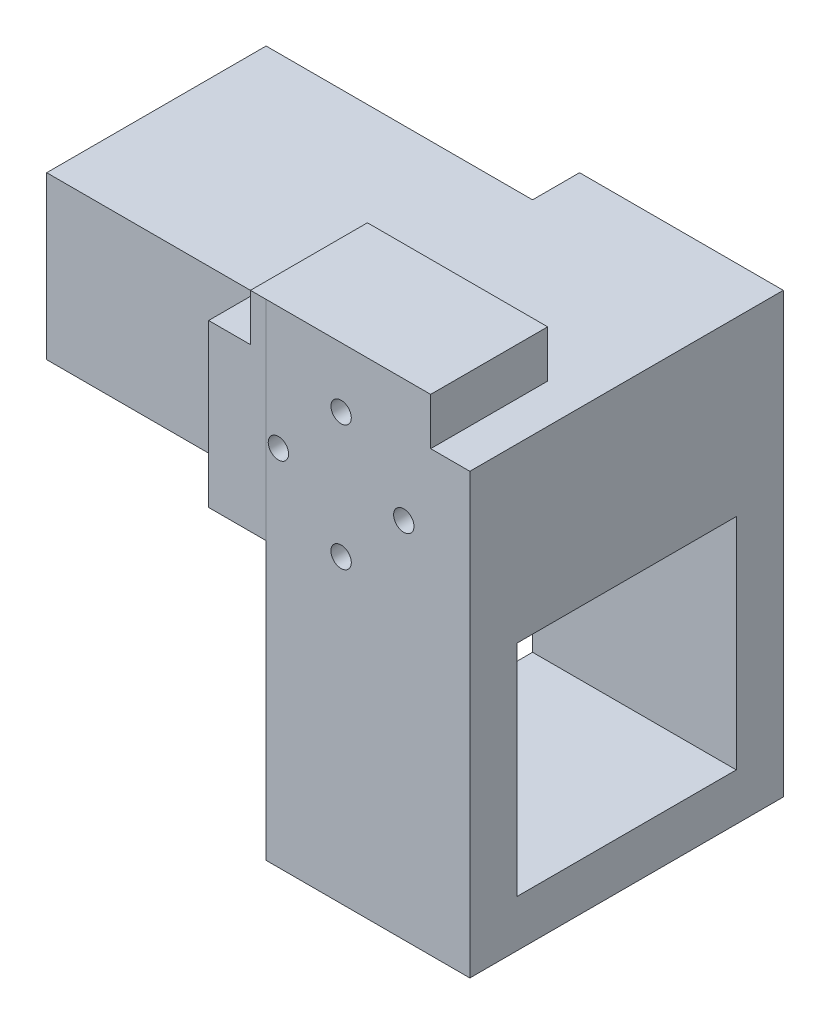
ISO-10303-21;
HEADER;
FILE_DESCRIPTION(('STEP AP214'),'2;1');
FILE_NAME('part.step','',(''),(''),'','','');
FILE_SCHEMA(('AUTOMOTIVE_DESIGN { 1 0 10303 214 1 1 1 1 }'));
ENDSEC;
DATA;
#1=APPLICATION_CONTEXT('core data for automotive mechanical design processes');
#2=APPLICATION_PROTOCOL_DEFINITION('international standard','automotive_design',2000,#1);
#3=PRODUCT_CONTEXT('',#1,'mechanical');
#4=PRODUCT('Part','Part','',(#3));
#5=PRODUCT_RELATED_PRODUCT_CATEGORY('part','',(#4));
#6=PRODUCT_DEFINITION_FORMATION('','',#4);
#7=PRODUCT_DEFINITION_CONTEXT('part definition',#1,'design');
#8=PRODUCT_DEFINITION('design','',#6,#7);
#9=PRODUCT_DEFINITION_SHAPE('','',#8);
#10=(LENGTH_UNIT() NAMED_UNIT(*) SI_UNIT(.MILLI.,.METRE.));
#11=(NAMED_UNIT(*) PLANE_ANGLE_UNIT() SI_UNIT($,.RADIAN.));
#12=(NAMED_UNIT(*) SI_UNIT($,.STERADIAN.) SOLID_ANGLE_UNIT());
#13=UNCERTAINTY_MEASURE_WITH_UNIT(LENGTH_MEASURE(1.E-05),#10,'distance_accuracy_value','');
#14=(GEOMETRIC_REPRESENTATION_CONTEXT(3) GLOBAL_UNCERTAINTY_ASSIGNED_CONTEXT((#13)) GLOBAL_UNIT_ASSIGNED_CONTEXT((#10,
#11,#12)) REPRESENTATION_CONTEXT('',''));
#15=CARTESIAN_POINT('',(0.,0.,0.));
#16=DIRECTION('',(0.,0.,1.));
#17=DIRECTION('',(1.,0.,0.));
#18=AXIS2_PLACEMENT_3D('',#15,#16,#17);
#19=CARTESIAN_POINT('',(-235.389488231933,53.9999999999804,-464.831385650681));
#20=DIRECTION('',(-3.56744395928794E-13,-1.,0.));
#21=DIRECTION('',(-1.,3.56744395928794E-13,5.6399329650958E-13));
#22=AXIS2_PLACEMENT_3D('',#19,#20,#21);
#23=PLANE('',#22);
#24=DIRECTION('',(-5.83825862534767E-13,0.,-1.));
#25=VECTOR('',#24,1.);
#26=CARTESIAN_POINT('',(-242.889488231913,53.9999999999831,-431.831385650679));
#27=LINE('',#26,#25);
#28=CARTESIAN_POINT('',(-242.889488231925,53.9999999999831,-451.831395650692));
#29=VERTEX_POINT('',#28);
#30=CARTESIAN_POINT('',(-242.889488231938,53.9999999999831,-474.223311815104));
#31=VERTEX_POINT('',#30);
#32=EDGE_CURVE('E180',#29,#31,#27,.T.);
#33=ORIENTED_EDGE('',*,*,#32,.F.);
#34=DIRECTION('',(1.,-3.56919355182225E-13,-5.6399329650958E-13));
#35=VECTOR('',#34,1.);
#36=CARTESIAN_POINT('',(-377.617379811657,54.0000000000311,-451.831395650616));
#37=LINE('',#36,#35);
#38=CARTESIAN_POINT('',(-235.389488231926,53.9999999999804,-451.831395650696));
#39=VERTEX_POINT('',#38);
#40=EDGE_CURVE('E220',#29,#39,#37,.T.);
#41=ORIENTED_EDGE('',*,*,#40,.T.);
#42=DIRECTION('',(5.6399329650958E-13,0.,1.));
#43=VECTOR('',#42,1.);
#44=CARTESIAN_POINT('',(-235.389488231933,53.9999999999804,-464.831385650681));
#45=LINE('',#44,#43);
#46=CARTESIAN_POINT('',(-235.389488231959,53.9999999999804,-511.831375650666));
#47=VERTEX_POINT('',#46);
#48=EDGE_CURVE('E321',#47,#39,#45,.T.);
#49=ORIENTED_EDGE('',*,*,#48,.F.);
#50=DIRECTION('',(1.,-3.56919355182225E-13,-5.6399329650958E-13));
#51=VECTOR('',#50,1.);
#52=CARTESIAN_POINT('',(-377.617379811691,54.0000000000311,-511.831375650586));
#53=LINE('',#52,#51);
#54=CARTESIAN_POINT('',(-274.389488231959,54.0000000000311,-511.831375650644));
#55=VERTEX_POINT('',#54);
#56=EDGE_CURVE('E275',#55,#47,#53,.T.);
#57=ORIENTED_EDGE('',*,*,#56,.F.);
#58=DIRECTION('',(-5.6399329650958E-13,0.,-1.));
#59=VECTOR('',#58,1.);
#60=CARTESIAN_POINT('',(-274.389488231959,53.9999999999943,-511.831375650644));
#61=LINE('',#60,#59);
#62=CARTESIAN_POINT('',(-274.389488231954,53.9999999999943,-502.831385650659));
#63=VERTEX_POINT('',#62);
#64=EDGE_CURVE('E241',#63,#55,#61,.T.);
#65=ORIENTED_EDGE('',*,*,#64,.F.);
#66=DIRECTION('',(-1.,3.56744395928794E-13,5.63993296509579E-13));
#67=VECTOR('',#66,1.);
#68=CARTESIAN_POINT('',(-235.389488231954,53.9999999999804,-502.831385650681));
#69=LINE('',#68,#67);
#70=CARTESIAN_POINT('',(-325.389488231954,54.0000000000125,-502.83138565063));
#71=VERTEX_POINT('',#70);
#72=EDGE_CURVE('E324',#63,#71,#69,.T.);
#73=ORIENTED_EDGE('',*,*,#72,.T.);
#74=DIRECTION('',(5.6399329650958E-13,0.,1.));
#75=VECTOR('',#74,1.);
#76=CARTESIAN_POINT('',(-325.389488231933,54.0000000000125,-464.83138565063));
#77=LINE('',#76,#75);
#78=CARTESIAN_POINT('',(-325.38948823193,54.0000000000125,-460.83138565063));
#79=VERTEX_POINT('',#78);
#80=EDGE_CURVE('E325',#71,#79,#77,.T.);
#81=ORIENTED_EDGE('',*,*,#80,.T.);
#82=DIRECTION('',(-1.,3.56744395928794E-13,5.63993296509579E-13));
#83=VECTOR('',#82,1.);
#84=CARTESIAN_POINT('',(-235.389488231931,53.9999999999804,-460.831385650681));
#85=LINE('',#84,#83);
#86=CARTESIAN_POINT('',(-285.389488231931,53.9999999999982,-460.831385650653));
#87=VERTEX_POINT('',#86);
#88=EDGE_CURVE('E11',#87,#79,#85,.T.);
#89=ORIENTED_EDGE('',*,*,#88,.F.);
#90=DIRECTION('',(-5.6399329650958E-13,0.,-1.));
#91=VECTOR('',#90,1.);
#92=CARTESIAN_POINT('',(-285.389488231926,53.9999999999943,-451.831385650653));
#93=LINE('',#92,#91);
#94=CARTESIAN_POINT('',(-285.389488231926,53.9999999999943,-451.831385650653));
#95=VERTEX_POINT('',#94);
#96=EDGE_CURVE('E199',#95,#87,#93,.T.);
#97=ORIENTED_EDGE('',*,*,#96,.F.);
#98=DIRECTION('',(-1.,0.,5.6399329650958E-13));
#99=VECTOR('',#98,1.);
#100=CARTESIAN_POINT('',(-274.389488231925,53.9999999999943,-451.831385650659));
#101=LINE('',#100,#99);
#102=CARTESIAN_POINT('',(-277.389488231926,53.9999999999954,-451.831385650657));
#103=VERTEX_POINT('',#102);
#104=EDGE_CURVE('E194',#103,#95,#101,.T.);
#105=ORIENTED_EDGE('',*,*,#104,.F.);
#106=DIRECTION('',(5.6399329650958E-13,0.,1.));
#107=VECTOR('',#106,1.);
#108=CARTESIAN_POINT('',(-277.389488231914,53.9999999999954,-431.831385650657));
#109=LINE('',#108,#107);
#110=CARTESIAN_POINT('',(-277.389488231938,53.9999999999954,-474.223311815085));
#111=VERTEX_POINT('',#110);
#112=EDGE_CURVE('E59',#111,#103,#109,.T.);
#113=ORIENTED_EDGE('',*,*,#112,.F.);
#114=DIRECTION('',(-1.,3.56762308549607E-13,5.6399329650958E-13));
#115=VECTOR('',#114,1.);
#116=CARTESIAN_POINT('',(-340.889478231938,54.000000000018,-474.223311815049));
#117=LINE('',#116,#115);
#118=EDGE_CURVE('E54',#31,#111,#117,.T.);
#119=ORIENTED_EDGE('',*,*,#118,.F.);
#120=EDGE_LOOP('',(#33,#41,#49,#57,#65,#73,#81,#89,#97,#105,#113,#119));
#121=FACE_BOUND('',#120,.T.);
#122=ADVANCED_FACE('F35',(#121),#23,.F.);
#123=CARTESIAN_POINT('',(-235.38948823194,27.0000199999797,-460.831385650681));
#124=DIRECTION('',(-5.63993296509579E-13,0.,-1.));
#125=DIRECTION('',(-1.,0.,5.6399329650958E-13));
#126=AXIS2_PLACEMENT_3D('',#123,#124,#125);
#127=PLANE('',#126);
#128=DIRECTION('',(0.,-1.,0.));
#129=VECTOR('',#128,1.);
#130=CARTESIAN_POINT('',(-285.389488231931,53.9999999999943,-460.831385650653));
#131=LINE('',#130,#129);
#132=CARTESIAN_POINT('',(-285.389488231931,23.0000199999976,-460.831385650653));
#133=VERTEX_POINT('',#132);
#134=EDGE_CURVE('E183',#87,#133,#131,.T.);
#135=ORIENTED_EDGE('',*,*,#134,.F.);
#136=ORIENTED_EDGE('',*,*,#88,.T.);
#137=DIRECTION('',(-3.56919355182225E-13,-1.,0.));
#138=VECTOR('',#137,1.);
#139=CARTESIAN_POINT('',(-325.38948823194,27.0000200000119,-460.83138565063));
#140=LINE('',#139,#138);
#141=CARTESIAN_POINT('',(-325.389488231942,23.0000200000118,-460.83138565063));
#142=VERTEX_POINT('',#141);
#143=EDGE_CURVE('E318',#79,#142,#140,.T.);
#144=ORIENTED_EDGE('',*,*,#143,.T.);
#145=DIRECTION('',(-1.,3.56744395928794E-13,5.63993296509579E-13));
#146=VECTOR('',#145,1.);
#147=CARTESIAN_POINT('',(-235.389488231942,23.0000199999797,-460.831385650681));
#148=LINE('',#147,#146);
#149=EDGE_CURVE('E46',#133,#142,#148,.T.);
#150=ORIENTED_EDGE('',*,*,#149,.F.);
#151=EDGE_LOOP('',(#135,#136,#144,#150));
#152=FACE_BOUND('',#151,.T.);
#153=ADVANCED_FACE('F37',(#152),#127,.F.);
#154=CARTESIAN_POINT('',(-274.389488231974,-5.70191141326313E-12,-502.831385650659));
#155=DIRECTION('',(1.,-3.56744395928794E-13,-5.63993296509579E-13));
#156=DIRECTION('',(-3.56744395928794E-13,-1.,0.));
#157=AXIS2_PLACEMENT_3D('',#154,#155,#156);
#158=PLANE('',#157);
#159=DIRECTION('',(5.6399329650958E-13,0.,1.));
#160=VECTOR('',#159,1.);
#161=CARTESIAN_POINT('',(-274.389488231981,-21.0000000000057,-502.831385650659));
#162=LINE('',#161,#160);
#163=CARTESIAN_POINT('',(-274.389488231981,-21.0000000000057,-502.831385650659));
#164=VERTEX_POINT('',#163);
#165=CARTESIAN_POINT('',(-274.389488231957,-21.0000000000057,-460.831385650659));
#166=VERTEX_POINT('',#165);
#167=EDGE_CURVE('E278',#164,#166,#162,.T.);
#168=ORIENTED_EDGE('',*,*,#167,.F.);
#169=DIRECTION('',(-3.56744395928794E-13,-1.,0.));
#170=VECTOR('',#169,1.);
#171=CARTESIAN_POINT('',(-274.389488231966,20.9999999999943,-502.831385650659));
#172=LINE('',#171,#170);
#173=CARTESIAN_POINT('',(-274.389488231966,21.0000000000311,-502.831385650659));
#174=VERTEX_POINT('',#173);
#175=EDGE_CURVE('E213',#174,#164,#172,.T.);
#176=ORIENTED_EDGE('',*,*,#175,.F.);
#177=DIRECTION('',(-5.6399329650958E-13,0.,-1.));
#178=VECTOR('',#177,1.);
#179=CARTESIAN_POINT('',(-274.389488231942,20.9999999999943,-460.831385650659));
#180=LINE('',#179,#178);
#181=CARTESIAN_POINT('',(-274.389488231942,20.9999999999943,-460.831385650659));
#182=VERTEX_POINT('',#181);
#183=EDGE_CURVE('E239',#182,#174,#180,.T.);
#184=ORIENTED_EDGE('',*,*,#183,.F.);
#185=DIRECTION('',(3.56744395928794E-13,1.,0.));
#186=VECTOR('',#185,1.);
#187=CARTESIAN_POINT('',(-274.389488231957,-21.0000000000057,-460.831385650659));
#188=LINE('',#187,#186);
#189=EDGE_CURVE('E233',#166,#182,#188,.T.);
#190=ORIENTED_EDGE('',*,*,#189,.F.);
#191=EDGE_LOOP('',(#168,#176,#184,#190));
#192=FACE_BOUND('',#191,.T.);
#193=DIRECTION('',(3.56744395928794E-13,1.,0.));
#194=VECTOR('',#193,1.);
#195=CARTESIAN_POINT('',(-274.389488231925,53.9999999999943,-451.831395650674));
#196=LINE('',#195,#194);
#197=CARTESIAN_POINT('',(-274.389488231955,-30.0000000000196,-451.831395650674));
#198=VERTEX_POINT('',#197);
#199=CARTESIAN_POINT('',(-274.389488231925,23.0000199999936,-451.831390650667));
#200=VERTEX_POINT('',#199);
#201=EDGE_CURVE('E339',#198,#200,#196,.T.);
#202=ORIENTED_EDGE('',*,*,#201,.T.);
#203=DIRECTION('',(-5.6399329650958E-13,0.,-1.));
#204=VECTOR('',#203,1.);
#205=CARTESIAN_POINT('',(-274.389488231942,23.0000199999936,-460.831385650659));
#206=LINE('',#205,#204);
#207=CARTESIAN_POINT('',(-274.389488231965,23.0000199999797,-502.831385650659));
#208=VERTEX_POINT('',#207);
#209=EDGE_CURVE('E232',#200,#208,#206,.T.);
#210=ORIENTED_EDGE('',*,*,#209,.T.);
#211=DIRECTION('',(3.56744395928794E-13,1.,0.));
#212=VECTOR('',#211,1.);
#213=CARTESIAN_POINT('',(-274.389488231965,23.0000199999937,-502.831385650659));
#214=LINE('',#213,#212);
#215=EDGE_CURVE('E234',#208,#63,#214,.T.);
#216=ORIENTED_EDGE('',*,*,#215,.T.);
#217=ORIENTED_EDGE('',*,*,#64,.T.);
#218=DIRECTION('',(-3.56744395928794E-13,-1.,0.));
#219=VECTOR('',#218,1.);
#220=CARTESIAN_POINT('',(-274.389488231989,-30.0000000000057,-511.831375650644));
#221=LINE('',#220,#219);
#222=CARTESIAN_POINT('',(-274.389488231989,-30.0000000000057,-511.831375650644));
#223=VERTEX_POINT('',#222);
#224=EDGE_CURVE('E244',#55,#223,#221,.T.);
#225=ORIENTED_EDGE('',*,*,#224,.T.);
#226=DIRECTION('',(5.6399329650958E-13,0.,1.));
#227=VECTOR('',#226,1.);
#228=CARTESIAN_POINT('',(-274.389488231955,-30.0000000000057,-451.831395650674));
#229=LINE('',#228,#227);
#230=EDGE_CURVE('E340',#223,#198,#229,.T.);
#231=ORIENTED_EDGE('',*,*,#230,.T.);
#232=EDGE_LOOP('',(#202,#210,#216,#217,#225,#231));
#233=FACE_BOUND('',#232,.T.);
#234=ADVANCED_FACE('F346',(#192,#233),#158,.F.);
#235=CARTESIAN_POINT('',(-235.389488231963,23.0000199999797,-498.831385650681));
#236=DIRECTION('',(3.56744395928794E-13,1.,0.));
#237=DIRECTION('',(1.,-3.56744395928794E-13,-5.6399329650958E-13));
#238=AXIS2_PLACEMENT_3D('',#235,#236,#237);
#239=PLANE('',#238);
#240=ORIENTED_EDGE('',*,*,#209,.F.);
#241=DIRECTION('',(1.,0.,-5.6399329650958E-13));
#242=VECTOR('',#241,1.);
#243=CARTESIAN_POINT('',(-274.389488231925,23.0000199999936,-451.831385650659));
#244=LINE('',#243,#242);
#245=CARTESIAN_POINT('',(-285.389488231926,23.0000199999936,-451.831385650653));
#246=VERTEX_POINT('',#245);
#247=EDGE_CURVE('E193',#246,#200,#244,.T.);
#248=ORIENTED_EDGE('',*,*,#247,.F.);
#249=DIRECTION('',(-5.6399329650958E-13,0.,-1.));
#250=VECTOR('',#249,1.);
#251=CARTESIAN_POINT('',(-285.389488231926,23.0000199999936,-451.831385650653));
#252=LINE('',#251,#250);
#253=EDGE_CURVE('E196',#246,#133,#252,.T.);
#254=ORIENTED_EDGE('',*,*,#253,.T.);
#255=ORIENTED_EDGE('',*,*,#149,.T.);
#256=DIRECTION('',(-5.6399329650958E-13,0.,-1.));
#257=VECTOR('',#256,1.);
#258=CARTESIAN_POINT('',(-325.389488231963,23.0000200000118,-498.83138565063));
#259=LINE('',#258,#257);
#260=CARTESIAN_POINT('',(-325.389488231965,23.0000200000118,-502.83138565063));
#261=VERTEX_POINT('',#260);
#262=EDGE_CURVE('E328',#142,#261,#259,.T.);
#263=ORIENTED_EDGE('',*,*,#262,.T.);
#264=DIRECTION('',(-1.,3.56744395928794E-13,5.63993296509579E-13));
#265=VECTOR('',#264,1.);
#266=CARTESIAN_POINT('',(-235.389488231965,23.0000199999797,-502.831385650681));
#267=LINE('',#266,#265);
#268=EDGE_CURVE('E337',#208,#261,#267,.T.);
#269=ORIENTED_EDGE('',*,*,#268,.F.);
#270=EDGE_LOOP('',(#240,#248,#254,#255,#263,#269));
#271=FACE_BOUND('',#270,.T.);
#272=ADVANCED_FACE('F404',(#271),#239,.F.);
#273=CARTESIAN_POINT('',(-235.389488231954,53.9999999999804,-502.831385650681));
#274=DIRECTION('',(5.63993296509579E-13,0.,1.));
#275=DIRECTION('',(1.,0.,-5.6399329650958E-13));
#276=AXIS2_PLACEMENT_3D('',#273,#274,#275);
#277=PLANE('',#276);
#278=ORIENTED_EDGE('',*,*,#215,.F.);
#279=ORIENTED_EDGE('',*,*,#268,.T.);
#280=DIRECTION('',(3.56919355182225E-13,1.,0.));
#281=VECTOR('',#280,1.);
#282=CARTESIAN_POINT('',(-325.389488231954,54.0000000000125,-502.83138565063));
#283=LINE('',#282,#281);
#284=EDGE_CURVE('E331',#261,#71,#283,.T.);
#285=ORIENTED_EDGE('',*,*,#284,.T.);
#286=ORIENTED_EDGE('',*,*,#72,.F.);
#287=EDGE_LOOP('',(#278,#279,#285,#286));
#288=FACE_BOUND('',#287,.T.);
#289=ADVANCED_FACE('F402',(#288),#277,.F.);
#290=CARTESIAN_POINT('',(-235.389488231934,-3.76392420697224E-11,-431.831385650681));
#291=DIRECTION('',(1.,-3.56919355182225E-13,-5.6399329650958E-13));
#292=DIRECTION('',(-3.56919355182225E-13,-1.,0.));
#293=AXIS2_PLACEMENT_3D('',#290,#291,#292);
#294=PLANE('',#293);
#295=DIRECTION('',(3.57022612531989E-13,1.,0.));
#296=VECTOR('',#295,1.);
#297=CARTESIAN_POINT('',(-235.389488231989,-30.0000000000196,-511.831375650666));
#298=LINE('',#297,#296);
#299=CARTESIAN_POINT('',(-235.389488231989,-30.0000000000196,-511.831375650666));
#300=VERTEX_POINT('',#299);
#301=EDGE_CURVE('E224',#300,#47,#298,.T.);
#302=ORIENTED_EDGE('',*,*,#301,.T.);
#303=ORIENTED_EDGE('',*,*,#48,.T.);
#304=DIRECTION('',(-3.57022612531989E-13,-1.,0.));
#305=VECTOR('',#304,1.);
#306=CARTESIAN_POINT('',(-235.389488231926,53.9999999999804,-451.831395650696));
#307=LINE('',#306,#305);
#308=CARTESIAN_POINT('',(-235.389488231955,-30.0000000000196,-451.831395650696));
#309=VERTEX_POINT('',#308);
#310=EDGE_CURVE('E262',#39,#309,#307,.T.);
#311=ORIENTED_EDGE('',*,*,#310,.T.);
#312=DIRECTION('',(-5.63993296509579E-13,0.,-1.));
#313=VECTOR('',#312,1.);
#314=CARTESIAN_POINT('',(-235.389488231955,-30.0000000000196,-451.831395650696));
#315=LINE('',#314,#313);
#316=EDGE_CURVE('E270',#309,#300,#315,.T.);
#317=ORIENTED_EDGE('',*,*,#316,.T.);
#318=EDGE_LOOP('',(#302,#303,#311,#317));
#319=FACE_BOUND('',#318,.T.);
#320=DIRECTION('',(-3.56857400772372E-13,-1.,0.));
#321=VECTOR('',#320,1.);
#322=CARTESIAN_POINT('',(-235.389488231957,-21.0000000000196,-460.831385650681));
#323=LINE('',#322,#321);
#324=CARTESIAN_POINT('',(-235.389488231942,20.9999999999804,-460.831385650681));
#325=VERTEX_POINT('',#324);
#326=CARTESIAN_POINT('',(-235.389488231957,-21.0000000000196,-460.831385650681));
#327=VERTEX_POINT('',#326);
#328=EDGE_CURVE('E202',#325,#327,#323,.T.);
#329=ORIENTED_EDGE('',*,*,#328,.F.);
#330=DIRECTION('',(5.6399329650958E-13,0.,1.));
#331=VECTOR('',#330,1.);
#332=CARTESIAN_POINT('',(-235.389488231942,20.9999999999804,-460.831385650681));
#333=LINE('',#332,#331);
#334=CARTESIAN_POINT('',(-235.389488231966,20.9999999999804,-502.831385650681));
#335=VERTEX_POINT('',#334);
#336=EDGE_CURVE('E256',#335,#325,#333,.T.);
#337=ORIENTED_EDGE('',*,*,#336,.F.);
#338=DIRECTION('',(3.56857400772372E-13,1.,0.));
#339=VECTOR('',#338,1.);
#340=CARTESIAN_POINT('',(-235.389488231966,20.9999999999804,-502.831385650681));
#341=LINE('',#340,#339);
#342=CARTESIAN_POINT('',(-235.389488231981,-21.0000000000196,-502.831385650681));
#343=VERTEX_POINT('',#342);
#344=EDGE_CURVE('E253',#343,#335,#341,.T.);
#345=ORIENTED_EDGE('',*,*,#344,.F.);
#346=DIRECTION('',(-5.6399329650958E-13,0.,-1.));
#347=VECTOR('',#346,1.);
#348=CARTESIAN_POINT('',(-235.389488231981,-21.0000000000196,-502.831385650681));
#349=LINE('',#348,#347);
#350=EDGE_CURVE('E250',#327,#343,#349,.T.);
#351=ORIENTED_EDGE('',*,*,#350,.F.);
#352=EDGE_LOOP('',(#329,#337,#345,#351));
#353=FACE_BOUND('',#352,.T.);
#354=ADVANCED_FACE('F358',(#319,#353),#294,.T.);
#355=CARTESIAN_POINT('',(-325.389488231934,-5.53224643613094E-12,-431.83138565063));
#356=DIRECTION('',(1.,-3.56919355182225E-13,-5.6399329650958E-13));
#357=DIRECTION('',(-3.56919355182225E-13,-1.,0.));
#358=AXIS2_PLACEMENT_3D('',#355,#356,#357);
#359=PLANE('',#358);
#360=CARTESIAN_POINT('',(-325.389488231952,46.0000100000125,-494.33138565063));
#361=DIRECTION('',(-1.,3.56919355182225E-13,5.6399329650958E-13));
#362=DIRECTION('',(3.56919355182225E-13,1.,0.));
#363=AXIS2_PLACEMENT_3D('',#360,#361,#362);
#364=CIRCLE('',#363,2.55);
#365=CARTESIAN_POINT('',(-325.389488231951,48.5500100000125,-494.33138565063));
#366=VERTEX_POINT('',#365);
#367=EDGE_CURVE('E312',#366,#366,#364,.T.);
#368=ORIENTED_EDGE('',*,*,#367,.F.);
#369=EDGE_LOOP('',(#368));
#370=FACE_BOUND('',#369,.T.);
#371=CARTESIAN_POINT('',(-325.389488231945,46.0000100000125,-481.83138565063));
#372=DIRECTION('',(-1.,3.56919355182225E-13,5.6399329650958E-13));
#373=DIRECTION('',(3.56919355182225E-13,1.,0.));
#374=AXIS2_PLACEMENT_3D('',#371,#372,#373);
#375=CIRCLE('',#374,2.55);
#376=CARTESIAN_POINT('',(-325.389488231944,48.5500100000125,-481.83138565063));
#377=VERTEX_POINT('',#376);
#378=EDGE_CURVE('E306',#377,#377,#375,.T.);
#379=ORIENTED_EDGE('',*,*,#378,.F.);
#380=EDGE_LOOP('',(#379));
#381=FACE_BOUND('',#380,.T.);
#382=CARTESIAN_POINT('',(-325.389488231938,46.0000100000125,-469.33138565063));
#383=DIRECTION('',(-1.,3.56919355182225E-13,5.6399329650958E-13));
#384=DIRECTION('',(3.56919355182225E-13,1.,0.));
#385=AXIS2_PLACEMENT_3D('',#382,#383,#384);
#386=CIRCLE('',#385,2.55);
#387=CARTESIAN_POINT('',(-325.389488231937,48.5500100000125,-469.33138565063));
#388=VERTEX_POINT('',#387);
#389=EDGE_CURVE('E300',#388,#388,#386,.T.);
#390=ORIENTED_EDGE('',*,*,#389,.F.);
#391=EDGE_LOOP('',(#390));
#392=FACE_BOUND('',#391,.T.);
#393=CARTESIAN_POINT('',(-325.389488231944,31.0000100000125,-469.33138565063));
#394=DIRECTION('',(-1.,3.56919355182225E-13,5.6399329650958E-13));
#395=DIRECTION('',(3.56919355182225E-13,1.,0.));
#396=AXIS2_PLACEMENT_3D('',#393,#394,#395);
#397=CIRCLE('',#396,2.55);
#398=CARTESIAN_POINT('',(-325.389488231943,33.5500100000125,-469.33138565063));
#399=VERTEX_POINT('',#398);
#400=EDGE_CURVE('E294',#399,#399,#397,.T.);
#401=ORIENTED_EDGE('',*,*,#400,.F.);
#402=EDGE_LOOP('',(#401));
#403=FACE_BOUND('',#402,.T.);
#404=CARTESIAN_POINT('',(-325.389488231951,31.0000100000125,-481.83138565063));
#405=DIRECTION('',(-1.,3.56919355182225E-13,5.6399329650958E-13));
#406=DIRECTION('',(3.56919355182225E-13,1.,0.));
#407=AXIS2_PLACEMENT_3D('',#404,#405,#406);
#408=CIRCLE('',#407,2.55);
#409=CARTESIAN_POINT('',(-325.38948823195,33.5500100000125,-481.83138565063));
#410=VERTEX_POINT('',#409);
#411=EDGE_CURVE('E288',#410,#410,#408,.T.);
#412=ORIENTED_EDGE('',*,*,#411,.F.);
#413=EDGE_LOOP('',(#412));
#414=FACE_BOUND('',#413,.T.);
#415=CARTESIAN_POINT('',(-325.389488231958,31.0000100000125,-494.33138565063));
#416=DIRECTION('',(-1.,3.56919355182225E-13,5.6399329650958E-13));
#417=DIRECTION('',(3.56919355182225E-13,1.,0.));
#418=AXIS2_PLACEMENT_3D('',#415,#416,#417);
#419=CIRCLE('',#418,2.55);
#420=CARTESIAN_POINT('',(-325.389488231957,33.5500100000125,-494.33138565063));
#421=VERTEX_POINT('',#420);
#422=EDGE_CURVE('E287',#421,#421,#419,.T.);
#423=ORIENTED_EDGE('',*,*,#422,.F.);
#424=EDGE_LOOP('',(#423));
#425=FACE_BOUND('',#424,.T.);
#426=ORIENTED_EDGE('',*,*,#143,.F.);
#427=ORIENTED_EDGE('',*,*,#80,.F.);
#428=ORIENTED_EDGE('',*,*,#284,.F.);
#429=ORIENTED_EDGE('',*,*,#262,.F.);
#430=EDGE_LOOP('',(#426,#427,#428,#429));
#431=FACE_BOUND('',#430,.T.);
#432=ADVANCED_FACE('F400',(#370,#381,#392,#403,#414,#425,#431),#359,.F.);
#433=CARTESIAN_POINT('',(-310.389488231958,31.0000100000071,-494.331385650639));
#434=DIRECTION('',(-1.,3.56919355182225E-13,5.6399329650958E-13));
#435=DIRECTION('',(3.56919355182225E-13,1.,0.));
#436=AXIS2_PLACEMENT_3D('',#433,#434,#435);
#437=CYLINDRICAL_SURFACE('',#436,2.55);
#438=CARTESIAN_POINT('',(-310.389488231958,31.0000100000071,-494.331385650639));
#439=DIRECTION('',(-1.,3.56919355182225E-13,5.6399329650958E-13));
#440=DIRECTION('',(3.56919355182225E-13,1.,0.));
#441=AXIS2_PLACEMENT_3D('',#438,#439,#440);
#442=CIRCLE('',#441,2.55);
#443=CARTESIAN_POINT('',(-310.389488231957,33.5500100000071,-494.331385650639));
#444=VERTEX_POINT('',#443);
#445=EDGE_CURVE('E315',#444,#444,#442,.T.);
#446=ORIENTED_EDGE('',*,*,#445,.F.);
#447=EDGE_LOOP('',(#446));
#448=FACE_BOUND('',#447,.T.);
#449=ORIENTED_EDGE('',*,*,#422,.T.);
#450=EDGE_LOOP('',(#449));
#451=FACE_BOUND('',#450,.T.);
#452=ADVANCED_FACE('F528',(#448,#451),#437,.F.);
#453=CARTESIAN_POINT('',(-310.389488231958,31.0000100000071,-494.331385650639));
#454=DIRECTION('',(-1.,3.56919355182225E-13,5.6399329650958E-13));
#455=DIRECTION('',(3.56919355182225E-13,1.,0.));
#456=AXIS2_PLACEMENT_3D('',#453,#454,#455);
#457=PLANE('',#456);
#458=ORIENTED_EDGE('',*,*,#445,.T.);
#459=EDGE_LOOP('',(#458));
#460=FACE_BOUND('',#459,.T.);
#461=ADVANCED_FACE('F498',(#460),#457,.T.);
#462=CARTESIAN_POINT('',(-310.389488231951,31.0000100000071,-481.831385650639));
#463=DIRECTION('',(-1.,3.56919355182225E-13,5.6399329650958E-13));
#464=DIRECTION('',(3.56919355182225E-13,1.,0.));
#465=AXIS2_PLACEMENT_3D('',#462,#463,#464);
#466=CYLINDRICAL_SURFACE('',#465,2.55);
#467=CARTESIAN_POINT('',(-310.389488231951,31.0000100000071,-481.831385650639));
#468=DIRECTION('',(-1.,3.56919355182225E-13,5.6399329650958E-13));
#469=DIRECTION('',(3.56919355182225E-13,1.,0.));
#470=AXIS2_PLACEMENT_3D('',#467,#468,#469);
#471=CIRCLE('',#470,2.55);
#472=CARTESIAN_POINT('',(-310.38948823195,33.5500100000071,-481.831385650639));
#473=VERTEX_POINT('',#472);
#474=EDGE_CURVE('E284',#473,#473,#471,.T.);
#475=ORIENTED_EDGE('',*,*,#474,.F.);
#476=EDGE_LOOP('',(#475));
#477=FACE_BOUND('',#476,.T.);
#478=ORIENTED_EDGE('',*,*,#411,.T.);
#479=EDGE_LOOP('',(#478));
#480=FACE_BOUND('',#479,.T.);
#481=ADVANCED_FACE('F494',(#477,#480),#466,.F.);
#482=CARTESIAN_POINT('',(-310.389488231951,31.0000100000071,-481.831385650639));
#483=DIRECTION('',(-1.,3.56919355182225E-13,5.6399329650958E-13));
#484=DIRECTION('',(3.56919355182225E-13,1.,0.));
#485=AXIS2_PLACEMENT_3D('',#482,#483,#484);
#486=PLANE('',#485);
#487=ORIENTED_EDGE('',*,*,#474,.T.);
#488=EDGE_LOOP('',(#487));
#489=FACE_BOUND('',#488,.T.);
#490=ADVANCED_FACE('F483',(#489),#486,.T.);
#491=CARTESIAN_POINT('',(-310.389488231944,31.0000100000071,-469.331385650639));
#492=DIRECTION('',(-1.,3.56919355182225E-13,5.6399329650958E-13));
#493=DIRECTION('',(3.56919355182225E-13,1.,0.));
#494=AXIS2_PLACEMENT_3D('',#491,#492,#493);
#495=CYLINDRICAL_SURFACE('',#494,2.55);
#496=CARTESIAN_POINT('',(-310.389488231944,31.0000100000071,-469.331385650639));
#497=DIRECTION('',(-1.,3.56919355182225E-13,5.6399329650958E-13));
#498=DIRECTION('',(3.56919355182225E-13,1.,0.));
#499=AXIS2_PLACEMENT_3D('',#496,#497,#498);
#500=CIRCLE('',#499,2.55);
#501=CARTESIAN_POINT('',(-310.389488231943,33.5500100000071,-469.331385650639));
#502=VERTEX_POINT('',#501);
#503=EDGE_CURVE('E291',#502,#502,#500,.T.);
#504=ORIENTED_EDGE('',*,*,#503,.F.);
#505=EDGE_LOOP('',(#504));
#506=FACE_BOUND('',#505,.T.);
#507=ORIENTED_EDGE('',*,*,#400,.T.);
#508=EDGE_LOOP('',(#507));
#509=FACE_BOUND('',#508,.T.);
#510=ADVANCED_FACE('F493',(#506,#509),#495,.F.);
#511=CARTESIAN_POINT('',(-310.389488231944,31.0000100000071,-469.331385650639));
#512=DIRECTION('',(-1.,3.56919355182225E-13,5.6399329650958E-13));
#513=DIRECTION('',(3.56919355182225E-13,1.,0.));
#514=AXIS2_PLACEMENT_3D('',#511,#512,#513);
#515=PLANE('',#514);
#516=ORIENTED_EDGE('',*,*,#503,.T.);
#517=EDGE_LOOP('',(#516));
#518=FACE_BOUND('',#517,.T.);
#519=ADVANCED_FACE('F500',(#518),#515,.T.);
#520=CARTESIAN_POINT('',(-310.389488231938,46.0000100000071,-469.331385650639));
#521=DIRECTION('',(-1.,3.56919355182225E-13,5.6399329650958E-13));
#522=DIRECTION('',(3.56919355182225E-13,1.,0.));
#523=AXIS2_PLACEMENT_3D('',#520,#521,#522);
#524=CYLINDRICAL_SURFACE('',#523,2.55);
#525=CARTESIAN_POINT('',(-310.389488231938,46.0000100000071,-469.331385650639));
#526=DIRECTION('',(-1.,3.56919355182225E-13,5.6399329650958E-13));
#527=DIRECTION('',(3.56919355182225E-13,1.,0.));
#528=AXIS2_PLACEMENT_3D('',#525,#526,#527);
#529=CIRCLE('',#528,2.55);
#530=CARTESIAN_POINT('',(-310.389488231937,48.5500100000071,-469.331385650639));
#531=VERTEX_POINT('',#530);
#532=EDGE_CURVE('E297',#531,#531,#529,.T.);
#533=ORIENTED_EDGE('',*,*,#532,.F.);
#534=EDGE_LOOP('',(#533));
#535=FACE_BOUND('',#534,.T.);
#536=ORIENTED_EDGE('',*,*,#389,.T.);
#537=EDGE_LOOP('',(#536));
#538=FACE_BOUND('',#537,.T.);
#539=ADVANCED_FACE('F503',(#535,#538),#524,.F.);
#540=CARTESIAN_POINT('',(-310.389488231938,46.0000100000071,-469.331385650639));
#541=DIRECTION('',(-1.,3.56919355182225E-13,5.6399329650958E-13));
#542=DIRECTION('',(3.56919355182225E-13,1.,0.));
#543=AXIS2_PLACEMENT_3D('',#540,#541,#542);
#544=PLANE('',#543);
#545=ORIENTED_EDGE('',*,*,#532,.T.);
#546=EDGE_LOOP('',(#545));
#547=FACE_BOUND('',#546,.T.);
#548=ADVANCED_FACE('F508',(#547),#544,.T.);
#549=CARTESIAN_POINT('',(-310.389488231945,46.0000100000071,-481.831385650639));
#550=DIRECTION('',(-1.,3.56919355182225E-13,5.6399329650958E-13));
#551=DIRECTION('',(3.56919355182225E-13,1.,0.));
#552=AXIS2_PLACEMENT_3D('',#549,#550,#551);
#553=CYLINDRICAL_SURFACE('',#552,2.55);
#554=CARTESIAN_POINT('',(-310.389488231945,46.0000100000071,-481.831385650639));
#555=DIRECTION('',(-1.,3.56919355182225E-13,5.6399329650958E-13));
#556=DIRECTION('',(3.56919355182225E-13,1.,0.));
#557=AXIS2_PLACEMENT_3D('',#554,#555,#556);
#558=CIRCLE('',#557,2.55);
#559=CARTESIAN_POINT('',(-310.389488231944,48.5500100000071,-481.831385650639));
#560=VERTEX_POINT('',#559);
#561=EDGE_CURVE('E303',#560,#560,#558,.T.);
#562=ORIENTED_EDGE('',*,*,#561,.F.);
#563=EDGE_LOOP('',(#562));
#564=FACE_BOUND('',#563,.T.);
#565=ORIENTED_EDGE('',*,*,#378,.T.);
#566=EDGE_LOOP('',(#565));
#567=FACE_BOUND('',#566,.T.);
#568=ADVANCED_FACE('F511',(#564,#567),#553,.F.);
#569=CARTESIAN_POINT('',(-310.389488231945,46.0000100000071,-481.831385650639));
#570=DIRECTION('',(-1.,3.56919355182225E-13,5.6399329650958E-13));
#571=DIRECTION('',(3.56919355182225E-13,1.,0.));
#572=AXIS2_PLACEMENT_3D('',#569,#570,#571);
#573=PLANE('',#572);
#574=ORIENTED_EDGE('',*,*,#561,.T.);
#575=EDGE_LOOP('',(#574));
#576=FACE_BOUND('',#575,.T.);
#577=ADVANCED_FACE('F516',(#576),#573,.T.);
#578=CARTESIAN_POINT('',(-310.389488231952,46.0000100000071,-494.331385650639));
#579=DIRECTION('',(-1.,3.56919355182225E-13,5.6399329650958E-13));
#580=DIRECTION('',(3.56919355182225E-13,1.,0.));
#581=AXIS2_PLACEMENT_3D('',#578,#579,#580);
#582=CYLINDRICAL_SURFACE('',#581,2.55);
#583=CARTESIAN_POINT('',(-310.389488231952,46.0000100000071,-494.331385650639));
#584=DIRECTION('',(-1.,3.56919355182225E-13,5.6399329650958E-13));
#585=DIRECTION('',(3.56919355182225E-13,1.,0.));
#586=AXIS2_PLACEMENT_3D('',#583,#584,#585);
#587=CIRCLE('',#586,2.55);
#588=CARTESIAN_POINT('',(-310.389488231951,48.5500100000071,-494.331385650639));
#589=VERTEX_POINT('',#588);
#590=EDGE_CURVE('E309',#589,#589,#587,.T.);
#591=ORIENTED_EDGE('',*,*,#590,.F.);
#592=EDGE_LOOP('',(#591));
#593=FACE_BOUND('',#592,.T.);
#594=ORIENTED_EDGE('',*,*,#367,.T.);
#595=EDGE_LOOP('',(#594));
#596=FACE_BOUND('',#595,.T.);
#597=ADVANCED_FACE('F475',(#593,#596),#582,.F.);
#598=CARTESIAN_POINT('',(-310.389488231952,46.0000100000071,-494.331385650639));
#599=DIRECTION('',(-1.,3.56919355182225E-13,5.6399329650958E-13));
#600=DIRECTION('',(3.56919355182225E-13,1.,0.));
#601=AXIS2_PLACEMENT_3D('',#598,#599,#600);
#602=PLANE('',#601);
#603=ORIENTED_EDGE('',*,*,#590,.T.);
#604=EDGE_LOOP('',(#603));
#605=FACE_BOUND('',#604,.T.);
#606=ADVANCED_FACE('F467',(#605),#602,.T.);
#607=CARTESIAN_POINT('',(-377.617379811657,54.0000000000311,-451.831395650616));
#608=DIRECTION('',(5.6399329650958E-13,0.,1.));
#609=DIRECTION('',(0.,1.,0.));
#610=AXIS2_PLACEMENT_3D('',#607,#608,#609);
#611=PLANE('',#610);
#612=CARTESIAN_POINT('',(-260.034313650955,51.5101937964349,-451.831395650682));
#613=DIRECTION('',(5.6399329650958E-13,0.,1.));
#614=DIRECTION('',(0.,1.,0.));
#615=AXIS2_PLACEMENT_3D('',#612,#613,#614);
#616=CIRCLE('',#615,1.95000000001596);
#617=CARTESIAN_POINT('',(-260.034313650955,53.4601937964509,-451.831395650682));
#618=VERTEX_POINT('',#617);
#619=EDGE_CURVE('E438',#618,#618,#616,.T.);
#620=ORIENTED_EDGE('',*,*,#619,.F.);
#621=EDGE_LOOP('',(#620));
#622=FACE_BOUND('',#621,.T.);
#623=CARTESIAN_POINT('',(-248.034313650954,39.5101937964351,-451.831395650689));
#624=DIRECTION('',(5.6399329650958E-13,0.,1.));
#625=DIRECTION('',(0.,1.,0.));
#626=AXIS2_PLACEMENT_3D('',#623,#624,#625);
#627=CIRCLE('',#626,1.95000000001596);
#628=CARTESIAN_POINT('',(-248.034313650954,41.460193796451,-451.831395650689));
#629=VERTEX_POINT('',#628);
#630=EDGE_CURVE('E448',#629,#629,#627,.T.);
#631=ORIENTED_EDGE('',*,*,#630,.F.);
#632=EDGE_LOOP('',(#631));
#633=FACE_BOUND('',#632,.T.);
#634=CARTESIAN_POINT('',(-260.034313650954,27.5101937964349,-451.831395650682));
#635=DIRECTION('',(5.6399329650958E-13,0.,1.));
#636=DIRECTION('',(0.,1.,0.));
#637=AXIS2_PLACEMENT_3D('',#634,#635,#636);
#638=CIRCLE('',#637,1.95000000001596);
#639=CARTESIAN_POINT('',(-260.034313650954,29.4601937964509,-451.831395650682));
#640=VERTEX_POINT('',#639);
#641=EDGE_CURVE('E454',#640,#640,#638,.T.);
#642=ORIENTED_EDGE('',*,*,#641,.F.);
#643=EDGE_LOOP('',(#642));
#644=FACE_BOUND('',#643,.T.);
#645=CARTESIAN_POINT('',(-272.034313650954,39.5101937964349,-451.831395650676));
#646=DIRECTION('',(5.6399329650958E-13,0.,1.));
#647=DIRECTION('',(0.,1.,0.));
#648=AXIS2_PLACEMENT_3D('',#645,#646,#647);
#649=CIRCLE('',#648,1.95000000001595);
#650=CARTESIAN_POINT('',(-272.034313650954,41.4601937964508,-451.831395650676));
#651=VERTEX_POINT('',#650);
#652=EDGE_CURVE('E460',#651,#651,#649,.T.);
#653=ORIENTED_EDGE('',*,*,#652,.F.);
#654=EDGE_LOOP('',(#653));
#655=FACE_BOUND('',#654,.T.);
#656=ORIENTED_EDGE('',*,*,#201,.F.);
#657=DIRECTION('',(1.,-3.56919355182225E-13,-5.6399329650958E-13));
#658=VECTOR('',#657,1.);
#659=CARTESIAN_POINT('',(-377.617379811687,-29.9999999999689,-451.831395650616));
#660=LINE('',#659,#658);
#661=EDGE_CURVE('E223',#198,#309,#660,.T.);
#662=ORIENTED_EDGE('',*,*,#661,.T.);
#663=ORIENTED_EDGE('',*,*,#310,.F.);
#664=ORIENTED_EDGE('',*,*,#40,.F.);
#665=DIRECTION('',(-3.56744395928794E-13,-1.,0.));
#666=VECTOR('',#665,1.);
#667=CARTESIAN_POINT('',(-242.889488231922,62.9999999999831,-451.831395650692));
#668=LINE('',#667,#666);
#669=CARTESIAN_POINT('',(-242.889488231922,62.9999999999831,-451.831395650692));
#670=VERTEX_POINT('',#669);
#671=EDGE_CURVE('E426',#670,#29,#668,.T.);
#672=ORIENTED_EDGE('',*,*,#671,.F.);
#673=DIRECTION('',(1.,-3.56762308549607E-13,-5.6399329650958E-13));
#674=VECTOR('',#673,1.);
#675=CARTESIAN_POINT('',(-340.889478231922,63.000000000018,-451.831395650637));
#676=LINE('',#675,#674);
#677=CARTESIAN_POINT('',(-274.389488231922,62.9999999999943,-451.831390650667));
#678=VERTEX_POINT('',#677);
#679=EDGE_CURVE('E428',#678,#670,#676,.T.);
#680=ORIENTED_EDGE('',*,*,#679,.F.);
#681=CARTESIAN_POINT('',(-274.389488231922,62.9999999999943,-451.831395650674));
#682=DIRECTION('',(0.,-1.,0.));
#683=VECTOR('',#682,1.);
#684=LINE('',#681,#683);
#685=CARTESIAN_POINT('',(-274.389488231925,53.9999999999943,-451.831395650674));
#686=VERTEX_POINT('',#685);
#687=EDGE_CURVE('E188',#678,#686,#684,.T.);
#688=ORIENTED_EDGE('',*,*,#687,.T.);
#689=EDGE_CURVE('E229',#200,#686,#196,.T.);
#690=ORIENTED_EDGE('',*,*,#689,.F.);
#691=EDGE_LOOP('',(#656,#662,#663,#664,#672,#680,#688,#690));
#692=FACE_BOUND('',#691,.T.);
#693=ADVANCED_FACE('F363',(#622,#633,#644,#655,#692),#611,.T.);
#694=CARTESIAN_POINT('',(-377.617379811687,-29.9999999999689,-451.831395650616));
#695=DIRECTION('',(-3.56919355182225E-13,-1.,0.));
#696=DIRECTION('',(-1.,3.56919355182225E-13,5.6399329650958E-13));
#697=AXIS2_PLACEMENT_3D('',#694,#695,#696);
#698=PLANE('',#697);
#699=ORIENTED_EDGE('',*,*,#230,.F.);
#700=DIRECTION('',(1.,-3.56919355182225E-13,-5.6399329650958E-13));
#701=VECTOR('',#700,1.);
#702=CARTESIAN_POINT('',(-377.617379811721,-29.9999999999689,-511.831375650586));
#703=LINE('',#702,#701);
#704=EDGE_CURVE('E279',#223,#300,#703,.T.);
#705=ORIENTED_EDGE('',*,*,#704,.T.);
#706=ORIENTED_EDGE('',*,*,#316,.F.);
#707=ORIENTED_EDGE('',*,*,#661,.F.);
#708=EDGE_LOOP('',(#699,#705,#706,#707));
#709=FACE_BOUND('',#708,.T.);
#710=ADVANCED_FACE('F353',(#709),#698,.T.);
#711=CARTESIAN_POINT('',(-377.617379811721,-29.9999999999689,-511.831375650586));
#712=DIRECTION('',(-5.6399329650958E-13,0.,-1.));
#713=DIRECTION('',(-1.,0.,5.6399329650958E-13));
#714=AXIS2_PLACEMENT_3D('',#711,#712,#713);
#715=PLANE('',#714);
#716=ORIENTED_EDGE('',*,*,#224,.F.);
#717=ORIENTED_EDGE('',*,*,#56,.T.);
#718=ORIENTED_EDGE('',*,*,#301,.F.);
#719=ORIENTED_EDGE('',*,*,#704,.F.);
#720=EDGE_LOOP('',(#716,#717,#718,#719));
#721=FACE_BOUND('',#720,.T.);
#722=ADVANCED_FACE('F356',(#721),#715,.T.);
#723=CARTESIAN_POINT('',(-377.617379811712,-20.9999999999689,-502.831385650601));
#724=DIRECTION('',(-3.56919355182225E-13,-1.,0.));
#725=DIRECTION('',(-1.,3.56919355182225E-13,5.6399329650958E-13));
#726=AXIS2_PLACEMENT_3D('',#723,#724,#725);
#727=PLANE('',#726);
#728=DIRECTION('',(1.,-3.56919355182225E-13,-5.6399329650958E-13));
#729=VECTOR('',#728,1.);
#730=CARTESIAN_POINT('',(-377.617379811712,-20.9999999999689,-502.831385650601));
#731=LINE('',#730,#729);
#732=EDGE_CURVE('E265',#164,#343,#731,.T.);
#733=ORIENTED_EDGE('',*,*,#732,.F.);
#734=ORIENTED_EDGE('',*,*,#167,.T.);
#735=DIRECTION('',(1.,-3.56919355182225E-13,-5.6399329650958E-13));
#736=VECTOR('',#735,1.);
#737=CARTESIAN_POINT('',(-377.617379811689,-20.9999999999689,-460.831385650601));
#738=LINE('',#737,#736);
#739=EDGE_CURVE('E259',#166,#327,#738,.T.);
#740=ORIENTED_EDGE('',*,*,#739,.T.);
#741=ORIENTED_EDGE('',*,*,#350,.T.);
#742=EDGE_LOOP('',(#733,#734,#740,#741));
#743=FACE_BOUND('',#742,.T.);
#744=ADVANCED_FACE('F643',(#743),#727,.F.);
#745=CARTESIAN_POINT('',(-377.617379811697,21.0000000000311,-502.831385650601));
#746=DIRECTION('',(-5.6399329650958E-13,0.,-1.));
#747=DIRECTION('',(-1.,0.,5.6399329650958E-13));
#748=AXIS2_PLACEMENT_3D('',#745,#746,#747);
#749=PLANE('',#748);
#750=DIRECTION('',(1.,-3.56919355182225E-13,-5.6399329650958E-13));
#751=VECTOR('',#750,1.);
#752=CARTESIAN_POINT('',(-377.617379811697,21.0000000000311,-502.831385650601));
#753=LINE('',#752,#751);
#754=EDGE_CURVE('E263',#174,#335,#753,.T.);
#755=ORIENTED_EDGE('',*,*,#754,.F.);
#756=ORIENTED_EDGE('',*,*,#175,.T.);
#757=ORIENTED_EDGE('',*,*,#732,.T.);
#758=ORIENTED_EDGE('',*,*,#344,.T.);
#759=EDGE_LOOP('',(#755,#756,#757,#758));
#760=FACE_BOUND('',#759,.T.);
#761=ADVANCED_FACE('F651',(#760),#749,.F.);
#762=CARTESIAN_POINT('',(-377.617379811674,21.0000000000311,-460.831385650601));
#763=DIRECTION('',(3.56919355182225E-13,1.,0.));
#764=DIRECTION('',(1.,-3.56919355182225E-13,-5.6399329650958E-13));
#765=AXIS2_PLACEMENT_3D('',#762,#763,#764);
#766=PLANE('',#765);
#767=DIRECTION('',(1.,-3.56919355182225E-13,-5.6399329650958E-13));
#768=VECTOR('',#767,1.);
#769=CARTESIAN_POINT('',(-377.617379811674,21.0000000000311,-460.831385650601));
#770=LINE('',#769,#768);
#771=EDGE_CURVE('E260',#182,#325,#770,.T.);
#772=ORIENTED_EDGE('',*,*,#771,.F.);
#773=ORIENTED_EDGE('',*,*,#183,.T.);
#774=ORIENTED_EDGE('',*,*,#754,.T.);
#775=ORIENTED_EDGE('',*,*,#336,.T.);
#776=EDGE_LOOP('',(#772,#773,#774,#775));
#777=FACE_BOUND('',#776,.T.);
#778=ADVANCED_FACE('F388',(#777),#766,.F.);
#779=CARTESIAN_POINT('',(-377.617379811689,-20.9999999999689,-460.831385650601));
#780=DIRECTION('',(5.6399329650958E-13,0.,1.));
#781=DIRECTION('',(0.,1.,0.));
#782=AXIS2_PLACEMENT_3D('',#779,#780,#781);
#783=PLANE('',#782);
#784=ORIENTED_EDGE('',*,*,#739,.F.);
#785=ORIENTED_EDGE('',*,*,#189,.T.);
#786=ORIENTED_EDGE('',*,*,#771,.T.);
#787=ORIENTED_EDGE('',*,*,#328,.T.);
#788=EDGE_LOOP('',(#784,#785,#786,#787));
#789=FACE_BOUND('',#788,.T.);
#790=ADVANCED_FACE('F380',(#789),#783,.F.);
#791=CARTESIAN_POINT('',(-274.389488231925,53.9999999999943,-451.831385650659));
#792=DIRECTION('',(-1.,0.,5.6399329650958E-13));
#793=DIRECTION('',(5.6399329650958E-13,0.,1.));
#794=AXIS2_PLACEMENT_3D('',#791,#792,#793);
#795=PLANE('',#794);
#796=ORIENTED_EDGE('',*,*,#689,.T.);
#797=DIRECTION('',(0.,1.,0.));
#798=VECTOR('',#797,1.);
#799=CARTESIAN_POINT('',(-274.389488231925,53.9999999999943,-451.831385650659));
#800=LINE('',#799,#798);
#801=EDGE_CURVE('E186',#200,#686,#800,.T.);
#802=ORIENTED_EDGE('',*,*,#801,.F.);
#803=EDGE_LOOP('',(#796,#802));
#804=FACE_BOUND('',#803,.T.);
#805=ADVANCED_FACE('F377',(#804),#795,.F.);
#806=CARTESIAN_POINT('',(-285.389488231926,53.9999999999943,-451.831385650653));
#807=DIRECTION('',(1.,0.,-5.6399329650958E-13));
#808=DIRECTION('',(-5.6399329650958E-13,0.,-1.));
#809=AXIS2_PLACEMENT_3D('',#806,#807,#808);
#810=PLANE('',#809);
#811=ORIENTED_EDGE('',*,*,#134,.T.);
#812=ORIENTED_EDGE('',*,*,#253,.F.);
#813=DIRECTION('',(0.,-1.,0.));
#814=VECTOR('',#813,1.);
#815=CARTESIAN_POINT('',(-285.389488231926,53.9999999999943,-451.831385650653));
#816=LINE('',#815,#814);
#817=EDGE_CURVE('E192',#95,#246,#816,.T.);
#818=ORIENTED_EDGE('',*,*,#817,.F.);
#819=ORIENTED_EDGE('',*,*,#96,.T.);
#820=EDGE_LOOP('',(#811,#812,#818,#819));
#821=FACE_BOUND('',#820,.T.);
#822=ADVANCED_FACE('F379',(#821),#810,.F.);
#823=CARTESIAN_POINT('',(-340.889478231945,0.,-451.831385650622));
#824=DIRECTION('',(-5.6399329650958E-13,0.,-1.));
#825=DIRECTION('',(-1.,0.,5.6399329650958E-13));
#826=AXIS2_PLACEMENT_3D('',#823,#824,#825);
#827=PLANE('',#826);
#828=ORIENTED_EDGE('',*,*,#801,.T.);
#829=ORIENTED_EDGE('',*,*,#687,.F.);
#830=DIRECTION('',(1.,-3.56762308549607E-13,-5.6399329650958E-13));
#831=VECTOR('',#830,1.);
#832=CARTESIAN_POINT('',(-340.889478231922,63.000000000018,-451.831385650622));
#833=LINE('',#832,#831);
#834=CARTESIAN_POINT('',(-277.389488231922,62.9999999999954,-451.831385650657));
#835=VERTEX_POINT('',#834);
#836=EDGE_CURVE('E170',#835,#678,#833,.T.);
#837=ORIENTED_EDGE('',*,*,#836,.F.);
#838=DIRECTION('',(-3.56744395928794E-13,-1.,0.));
#839=VECTOR('',#838,1.);
#840=CARTESIAN_POINT('',(-277.389488231922,62.9999999999954,-451.831385650657));
#841=LINE('',#840,#839);
#842=EDGE_CURVE('E167',#835,#103,#841,.T.);
#843=ORIENTED_EDGE('',*,*,#842,.T.);
#844=ORIENTED_EDGE('',*,*,#104,.T.);
#845=ORIENTED_EDGE('',*,*,#817,.T.);
#846=ORIENTED_EDGE('',*,*,#247,.T.);
#847=EDGE_LOOP('',(#828,#829,#837,#843,#844,#845,#846));
#848=FACE_BOUND('',#847,.T.);
#849=ADVANCED_FACE('F373',(#848),#827,.F.);
#850=CARTESIAN_POINT('',(-340.889478231935,63.000000000018,-474.223311815049));
#851=DIRECTION('',(5.6399329650958E-13,0.,1.));
#852=DIRECTION('',(1.,0.,-5.6399329650958E-13));
#853=AXIS2_PLACEMENT_3D('',#850,#851,#852);
#854=PLANE('',#853);
#855=ORIENTED_EDGE('',*,*,#118,.T.);
#856=DIRECTION('',(-3.56744395928794E-13,-1.,0.));
#857=VECTOR('',#856,1.);
#858=CARTESIAN_POINT('',(-277.389488231935,62.9999999999954,-474.223311815085));
#859=LINE('',#858,#857);
#860=CARTESIAN_POINT('',(-277.389488231935,62.9999999999954,-474.223311815085));
#861=VERTEX_POINT('',#860);
#862=EDGE_CURVE('E165',#861,#111,#859,.T.);
#863=ORIENTED_EDGE('',*,*,#862,.F.);
#864=DIRECTION('',(-1.,3.56762308549607E-13,5.6399329650958E-13));
#865=VECTOR('',#864,1.);
#866=CARTESIAN_POINT('',(-340.889478231935,63.000000000018,-474.223311815049));
#867=LINE('',#866,#865);
#868=CARTESIAN_POINT('',(-242.889488231935,62.9999999999831,-474.223311815104));
#869=VERTEX_POINT('',#868);
#870=EDGE_CURVE('E171',#869,#861,#867,.T.);
#871=ORIENTED_EDGE('',*,*,#870,.F.);
#872=DIRECTION('',(-3.56744395928794E-13,-1.,0.));
#873=VECTOR('',#872,1.);
#874=CARTESIAN_POINT('',(-242.889488231935,62.9999999999831,-474.223311815104));
#875=LINE('',#874,#873);
#876=EDGE_CURVE('E425',#869,#31,#875,.T.);
#877=ORIENTED_EDGE('',*,*,#876,.T.);
#878=EDGE_LOOP('',(#855,#863,#871,#877));
#879=FACE_BOUND('',#878,.T.);
#880=ADVANCED_FACE('F182',(#879),#854,.F.);
#881=CARTESIAN_POINT('',(-277.389488231911,62.9999999999954,-431.831385650657));
#882=DIRECTION('',(1.,-3.56744395928794E-13,-5.6399329650958E-13));
#883=DIRECTION('',(-3.56744395928794E-13,-1.,0.));
#884=AXIS2_PLACEMENT_3D('',#881,#882,#883);
#885=PLANE('',#884);
#886=ORIENTED_EDGE('',*,*,#112,.T.);
#887=ORIENTED_EDGE('',*,*,#842,.F.);
#888=DIRECTION('',(5.6399329650958E-13,0.,1.));
#889=VECTOR('',#888,1.);
#890=CARTESIAN_POINT('',(-277.389488231911,62.9999999999954,-431.831385650657));
#891=LINE('',#890,#889);
#892=EDGE_CURVE('E161',#861,#835,#891,.T.);
#893=ORIENTED_EDGE('',*,*,#892,.F.);
#894=ORIENTED_EDGE('',*,*,#862,.T.);
#895=EDGE_LOOP('',(#886,#887,#893,#894));
#896=FACE_BOUND('',#895,.T.);
#897=ADVANCED_FACE('F163',(#896),#885,.F.);
#898=CARTESIAN_POINT('',(-242.88948823191,62.9999999999831,-431.831385650679));
#899=DIRECTION('',(-1.,3.56744395928794E-13,5.83825862534767E-13));
#900=DIRECTION('',(3.56744395928794E-13,1.,0.));
#901=AXIS2_PLACEMENT_3D('',#898,#899,#900);
#902=PLANE('',#901);
#903=ORIENTED_EDGE('',*,*,#32,.T.);
#904=ORIENTED_EDGE('',*,*,#876,.F.);
#905=DIRECTION('',(-5.83825862534767E-13,0.,-1.));
#906=VECTOR('',#905,1.);
#907=CARTESIAN_POINT('',(-242.88948823191,62.9999999999831,-431.831385650679));
#908=LINE('',#907,#906);
#909=EDGE_CURVE('E176',#670,#869,#908,.T.);
#910=ORIENTED_EDGE('',*,*,#909,.F.);
#911=ORIENTED_EDGE('',*,*,#671,.T.);
#912=EDGE_LOOP('',(#903,#904,#910,#911));
#913=FACE_BOUND('',#912,.T.);
#914=ADVANCED_FACE('F427',(#913),#902,.F.);
#915=CARTESIAN_POINT('',(-340.889478231911,63.000000000018,-431.831385650622));
#916=DIRECTION('',(3.56762308549607E-13,1.,0.));
#917=DIRECTION('',(1.,-3.56762308549607E-13,-5.6399329650958E-13));
#918=AXIS2_PLACEMENT_3D('',#915,#916,#917);
#919=PLANE('',#918);
#920=ORIENTED_EDGE('',*,*,#870,.T.);
#921=ORIENTED_EDGE('',*,*,#892,.T.);
#922=ORIENTED_EDGE('',*,*,#836,.T.);
#923=ORIENTED_EDGE('',*,*,#679,.T.);
#924=ORIENTED_EDGE('',*,*,#909,.T.);
#925=EDGE_LOOP('',(#920,#921,#922,#923,#924));
#926=FACE_BOUND('',#925,.T.);
#927=ADVANCED_FACE('F174',(#926),#919,.T.);
#928=CARTESIAN_POINT('',(-272.03431365096,39.5101937964349,-461.831395650676));
#929=DIRECTION('',(5.6399329650958E-13,0.,1.));
#930=DIRECTION('',(0.,1.,0.));
#931=AXIS2_PLACEMENT_3D('',#928,#929,#930);
#932=CYLINDRICAL_SURFACE('',#931,1.95000000001595);
#933=CARTESIAN_POINT('',(-272.03431365096,39.5101937964349,-461.831395650676));
#934=DIRECTION('',(5.6399329650958E-13,0.,1.));
#935=DIRECTION('',(0.,1.,0.));
#936=AXIS2_PLACEMENT_3D('',#933,#934,#935);
#937=CIRCLE('',#936,1.95000000001595);
#938=CARTESIAN_POINT('',(-272.03431365096,41.4601937964508,-461.831395650676));
#939=VERTEX_POINT('',#938);
#940=EDGE_CURVE('E457',#939,#939,#937,.T.);
#941=ORIENTED_EDGE('',*,*,#940,.F.);
#942=EDGE_LOOP('',(#941));
#943=FACE_BOUND('',#942,.T.);
#944=ORIENTED_EDGE('',*,*,#652,.T.);
#945=EDGE_LOOP('',(#944));
#946=FACE_BOUND('',#945,.T.);
#947=ADVANCED_FACE('F464',(#943,#946),#932,.F.);
#948=CARTESIAN_POINT('',(-272.03431365096,39.5101937964349,-461.831395650676));
#949=DIRECTION('',(5.6399329650958E-13,0.,1.));
#950=DIRECTION('',(0.,1.,0.));
#951=AXIS2_PLACEMENT_3D('',#948,#949,#950);
#952=PLANE('',#951);
#953=ORIENTED_EDGE('',*,*,#940,.T.);
#954=EDGE_LOOP('',(#953));
#955=FACE_BOUND('',#954,.T.);
#956=ADVANCED_FACE('F744',(#955),#952,.T.);
#957=CARTESIAN_POINT('',(-260.03431365096,27.5101937964349,-461.831395650682));
#958=DIRECTION('',(5.6399329650958E-13,0.,1.));
#959=DIRECTION('',(0.,1.,0.));
#960=AXIS2_PLACEMENT_3D('',#957,#958,#959);
#961=CYLINDRICAL_SURFACE('',#960,1.95000000001596);
#962=CARTESIAN_POINT('',(-260.03431365096,27.5101937964349,-461.831395650682));
#963=DIRECTION('',(5.6399329650958E-13,0.,1.));
#964=DIRECTION('',(0.,1.,0.));
#965=AXIS2_PLACEMENT_3D('',#962,#963,#964);
#966=CIRCLE('',#965,1.95000000001596);
#967=CARTESIAN_POINT('',(-260.03431365096,29.4601937964509,-461.831395650682));
#968=VERTEX_POINT('',#967);
#969=EDGE_CURVE('E451',#968,#968,#966,.T.);
#970=ORIENTED_EDGE('',*,*,#969,.F.);
#971=EDGE_LOOP('',(#970));
#972=FACE_BOUND('',#971,.T.);
#973=ORIENTED_EDGE('',*,*,#641,.T.);
#974=EDGE_LOOP('',(#973));
#975=FACE_BOUND('',#974,.T.);
#976=ADVANCED_FACE('F754',(#972,#975),#961,.F.);
#977=CARTESIAN_POINT('',(-260.03431365096,27.5101937964349,-461.831395650682));
#978=DIRECTION('',(5.6399329650958E-13,0.,1.));
#979=DIRECTION('',(0.,1.,0.));
#980=AXIS2_PLACEMENT_3D('',#977,#978,#979);
#981=PLANE('',#980);
#982=ORIENTED_EDGE('',*,*,#969,.T.);
#983=EDGE_LOOP('',(#982));
#984=FACE_BOUND('',#983,.T.);
#985=ADVANCED_FACE('F764',(#984),#981,.T.);
#986=CARTESIAN_POINT('',(-248.03431365096,39.5101937964351,-461.831395650689));
#987=DIRECTION('',(5.6399329650958E-13,0.,1.));
#988=DIRECTION('',(0.,1.,0.));
#989=AXIS2_PLACEMENT_3D('',#986,#987,#988);
#990=CYLINDRICAL_SURFACE('',#989,1.95000000001596);
#991=CARTESIAN_POINT('',(-248.03431365096,39.5101937964351,-461.831395650689));
#992=DIRECTION('',(5.6399329650958E-13,0.,1.));
#993=DIRECTION('',(0.,1.,0.));
#994=AXIS2_PLACEMENT_3D('',#991,#992,#993);
#995=CIRCLE('',#994,1.95000000001596);
#996=CARTESIAN_POINT('',(-248.03431365096,41.460193796451,-461.831395650689));
#997=VERTEX_POINT('',#996);
#998=EDGE_CURVE('E443',#997,#997,#995,.T.);
#999=ORIENTED_EDGE('',*,*,#998,.F.);
#1000=EDGE_LOOP('',(#999));
#1001=FACE_BOUND('',#1000,.T.);
#1002=ORIENTED_EDGE('',*,*,#630,.T.);
#1003=EDGE_LOOP('',(#1002));
#1004=FACE_BOUND('',#1003,.T.);
#1005=ADVANCED_FACE('F774',(#1001,#1004),#990,.F.);
#1006=CARTESIAN_POINT('',(-248.03431365096,39.5101937964351,-461.831395650689));
#1007=DIRECTION('',(5.6399329650958E-13,0.,1.));
#1008=DIRECTION('',(0.,1.,0.));
#1009=AXIS2_PLACEMENT_3D('',#1006,#1007,#1008);
#1010=PLANE('',#1009);
#1011=ORIENTED_EDGE('',*,*,#998,.T.);
#1012=EDGE_LOOP('',(#1011));
#1013=FACE_BOUND('',#1012,.T.);
#1014=ADVANCED_FACE('F784',(#1013),#1010,.T.);
#1015=CARTESIAN_POINT('',(-260.03431365096,51.5101937964349,-461.831395650682));
#1016=DIRECTION('',(5.6399329650958E-13,0.,1.));
#1017=DIRECTION('',(0.,1.,0.));
#1018=AXIS2_PLACEMENT_3D('',#1015,#1016,#1017);
#1019=CYLINDRICAL_SURFACE('',#1018,1.95000000001596);
#1020=CARTESIAN_POINT('',(-260.03431365096,51.5101937964349,-461.831395650682));
#1021=DIRECTION('',(5.6399329650958E-13,0.,1.));
#1022=DIRECTION('',(0.,1.,0.));
#1023=AXIS2_PLACEMENT_3D('',#1020,#1021,#1022);
#1024=CIRCLE('',#1023,1.95000000001596);
#1025=CARTESIAN_POINT('',(-260.03431365096,53.4601937964509,-461.831395650682));
#1026=VERTEX_POINT('',#1025);
#1027=EDGE_CURVE('E436',#1026,#1026,#1024,.T.);
#1028=ORIENTED_EDGE('',*,*,#1027,.F.);
#1029=EDGE_LOOP('',(#1028));
#1030=FACE_BOUND('',#1029,.T.);
#1031=ORIENTED_EDGE('',*,*,#619,.T.);
#1032=EDGE_LOOP('',(#1031));
#1033=FACE_BOUND('',#1032,.T.);
#1034=ADVANCED_FACE('F794',(#1030,#1033),#1019,.F.);
#1035=CARTESIAN_POINT('',(-260.03431365096,51.5101937964349,-461.831395650682));
#1036=DIRECTION('',(5.6399329650958E-13,0.,1.));
#1037=DIRECTION('',(0.,1.,0.));
#1038=AXIS2_PLACEMENT_3D('',#1035,#1036,#1037);
#1039=PLANE('',#1038);
#1040=ORIENTED_EDGE('',*,*,#1027,.T.);
#1041=EDGE_LOOP('',(#1040));
#1042=FACE_BOUND('',#1041,.T.);
#1043=ADVANCED_FACE('F804',(#1042),#1039,.T.);
#1044=CLOSED_SHELL('',(#122,#153,#234,#272,#289,#354,#432,#452,#461,#481,#490,#510,#519,#539,
#548,#568,#577,#597,#606,#693,#710,#722,#744,#761,#778,#790,#805,#822,#849,#880,#897,#914,#927,
#947,#956,#976,#985,#1005,#1014,#1034,#1043));
#1045=MANIFOLD_SOLID_BREP('B2',#1044);
#1046=ADVANCED_BREP_SHAPE_REPRESENTATION('',(#18,#1045),#14);
#1047=SHAPE_DEFINITION_REPRESENTATION(#9,#1046);
ENDSEC;
END-ISO-10303-21;
